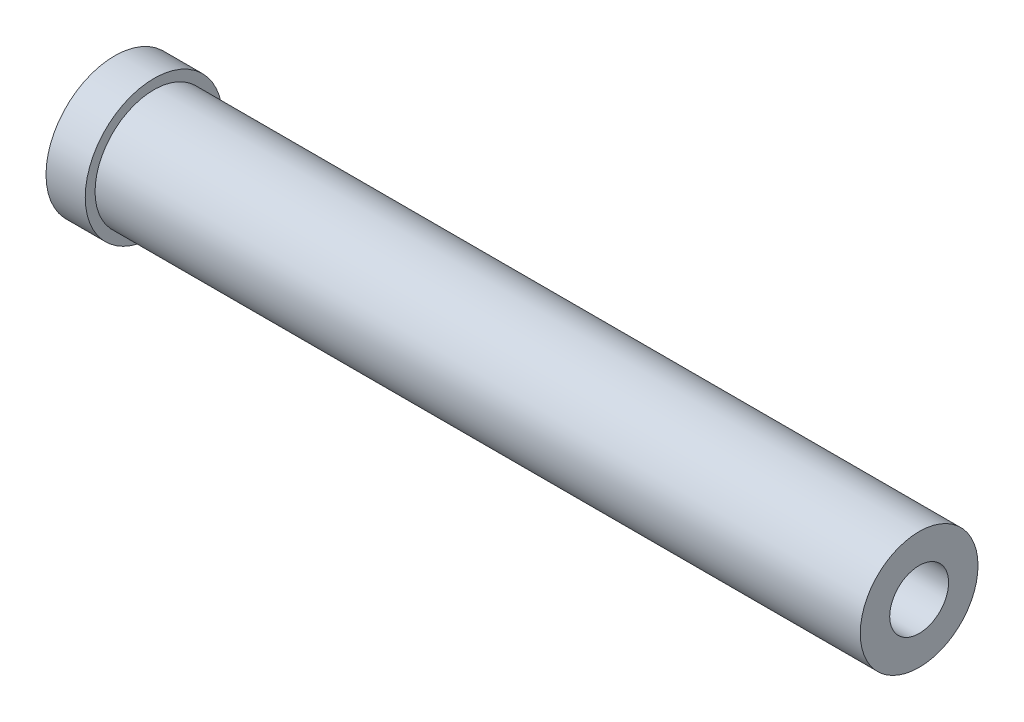
ISO-10303-21;
HEADER;
FILE_DESCRIPTION(('STEP AP214'),'2;1');
FILE_NAME('part.step','',(''),(''),'','','');
FILE_SCHEMA(('AUTOMOTIVE_DESIGN { 1 0 10303 214 1 1 1 1 }'));
ENDSEC;
DATA;
#1=APPLICATION_CONTEXT('core data for automotive mechanical design processes');
#2=APPLICATION_PROTOCOL_DEFINITION('international standard','automotive_design',2000,#1);
#3=PRODUCT_CONTEXT('',#1,'mechanical');
#4=PRODUCT('Part','Part','',(#3));
#5=PRODUCT_RELATED_PRODUCT_CATEGORY('part','',(#4));
#6=PRODUCT_DEFINITION_FORMATION('','',#4);
#7=PRODUCT_DEFINITION_CONTEXT('part definition',#1,'design');
#8=PRODUCT_DEFINITION('design','',#6,#7);
#9=PRODUCT_DEFINITION_SHAPE('','',#8);
#10=(LENGTH_UNIT() NAMED_UNIT(*) SI_UNIT(.MILLI.,.METRE.));
#11=(NAMED_UNIT(*) PLANE_ANGLE_UNIT() SI_UNIT($,.RADIAN.));
#12=(NAMED_UNIT(*) SI_UNIT($,.STERADIAN.) SOLID_ANGLE_UNIT());
#13=UNCERTAINTY_MEASURE_WITH_UNIT(LENGTH_MEASURE(1.E-05),#10,'distance_accuracy_value','');
#14=(GEOMETRIC_REPRESENTATION_CONTEXT(3) GLOBAL_UNCERTAINTY_ASSIGNED_CONTEXT((#13)) GLOBAL_UNIT_ASSIGNED_CONTEXT((#10,
#11,#12)) REPRESENTATION_CONTEXT('',''));
#15=CARTESIAN_POINT('',(0.,0.,0.));
#16=DIRECTION('',(0.,0.,1.));
#17=DIRECTION('',(1.,0.,0.));
#18=AXIS2_PLACEMENT_3D('',#15,#16,#17);
#19=CARTESIAN_POINT('',(-26.67,0.,0.));
#20=DIRECTION('',(1.,0.,0.));
#21=DIRECTION('',(0.,0.,-1.));
#22=AXIS2_PLACEMENT_3D('',#19,#20,#21);
#23=CYLINDRICAL_SURFACE('',#22,4.445);
#24=CARTESIAN_POINT('',(-26.67,0.,0.));
#25=DIRECTION('',(-1.,0.,0.));
#26=DIRECTION('',(0.,0.,1.));
#27=AXIS2_PLACEMENT_3D('',#24,#25,#26);
#28=CIRCLE('',#27,4.445);
#29=CARTESIAN_POINT('',(-26.67,0.,4.445));
#30=VERTEX_POINT('',#29);
#31=EDGE_CURVE('E69',#30,#30,#28,.T.);
#32=ORIENTED_EDGE('',*,*,#31,.F.);
#33=EDGE_LOOP('',(#32));
#34=FACE_BOUND('',#33,.T.);
#35=CARTESIAN_POINT('',(-24.13,0.,0.));
#36=DIRECTION('',(-1.,0.,0.));
#37=DIRECTION('',(0.,0.,1.));
#38=AXIS2_PLACEMENT_3D('',#35,#36,#37);
#39=CIRCLE('',#38,4.445);
#40=CARTESIAN_POINT('',(-24.13,0.,4.445));
#41=VERTEX_POINT('',#40);
#42=EDGE_CURVE('E61',#41,#41,#39,.T.);
#43=ORIENTED_EDGE('',*,*,#42,.T.);
#44=EDGE_LOOP('',(#43));
#45=FACE_BOUND('',#44,.T.);
#46=ADVANCED_FACE('F43',(#34,#45),#23,.T.);
#47=CARTESIAN_POINT('',(-26.67,0.,0.));
#48=DIRECTION('',(-1.,0.,0.));
#49=DIRECTION('',(0.,0.,1.));
#50=AXIS2_PLACEMENT_3D('',#47,#48,#49);
#51=PLANE('',#50);
#52=ORIENTED_EDGE('',*,*,#31,.T.);
#53=EDGE_LOOP('',(#52));
#54=FACE_BOUND('',#53,.T.);
#55=ADVANCED_FACE('F83',(#54),#51,.T.);
#56=CARTESIAN_POINT('',(-24.13,0.,0.));
#57=DIRECTION('',(-1.,0.,0.));
#58=DIRECTION('',(0.,0.,1.));
#59=AXIS2_PLACEMENT_3D('',#56,#57,#58);
#60=PLANE('',#59);
#61=CARTESIAN_POINT('',(-24.13,0.,0.));
#62=DIRECTION('',(-1.,0.,0.));
#63=DIRECTION('',(0.,0.,1.));
#64=AXIS2_PLACEMENT_3D('',#61,#62,#63);
#65=CIRCLE('',#64,3.81);
#66=CARTESIAN_POINT('',(-24.13,0.,3.81));
#67=VERTEX_POINT('',#66);
#68=EDGE_CURVE('E10',#67,#67,#65,.T.);
#69=ORIENTED_EDGE('',*,*,#68,.T.);
#70=EDGE_LOOP('',(#69));
#71=FACE_BOUND('',#70,.T.);
#72=ORIENTED_EDGE('',*,*,#42,.F.);
#73=EDGE_LOOP('',(#72));
#74=FACE_BOUND('',#73,.T.);
#75=ADVANCED_FACE('F81',(#71,#74),#60,.F.);
#76=CARTESIAN_POINT('',(25.4,0.,0.));
#77=DIRECTION('',(-1.,0.,0.));
#78=DIRECTION('',(0.,0.,1.));
#79=AXIS2_PLACEMENT_3D('',#76,#77,#78);
#80=CYLINDRICAL_SURFACE('',#79,3.81);
#81=CARTESIAN_POINT('',(25.4,0.,0.));
#82=DIRECTION('',(1.,0.,0.));
#83=DIRECTION('',(0.,0.,-1.));
#84=AXIS2_PLACEMENT_3D('',#81,#82,#83);
#85=CIRCLE('',#84,3.81);
#86=CARTESIAN_POINT('',(25.4,0.,-3.81));
#87=VERTEX_POINT('',#86);
#88=EDGE_CURVE('E52',#87,#87,#85,.T.);
#89=ORIENTED_EDGE('',*,*,#88,.F.);
#90=EDGE_LOOP('',(#89));
#91=FACE_BOUND('',#90,.T.);
#92=ORIENTED_EDGE('',*,*,#68,.F.);
#93=EDGE_LOOP('',(#92));
#94=FACE_BOUND('',#93,.T.);
#95=ADVANCED_FACE('F45',(#91,#94),#80,.T.);
#96=CARTESIAN_POINT('',(25.4,0.,0.));
#97=DIRECTION('',(-1.,0.,0.));
#98=DIRECTION('',(0.,0.,1.));
#99=AXIS2_PLACEMENT_3D('',#96,#97,#98);
#100=CYLINDRICAL_SURFACE('',#99,1.905);
#101=CARTESIAN_POINT('',(25.4,0.,0.));
#102=DIRECTION('',(1.,0.,0.));
#103=DIRECTION('',(0.,0.,-1.));
#104=AXIS2_PLACEMENT_3D('',#101,#102,#103);
#105=CIRCLE('',#104,1.905);
#106=CARTESIAN_POINT('',(25.4,0.,-1.905));
#107=VERTEX_POINT('',#106);
#108=EDGE_CURVE('E58',#107,#107,#105,.T.);
#109=ORIENTED_EDGE('',*,*,#108,.T.);
#110=EDGE_LOOP('',(#109));
#111=FACE_BOUND('',#110,.T.);
#112=CARTESIAN_POINT('',(-24.13,0.,0.));
#113=DIRECTION('',(-1.,0.,0.));
#114=DIRECTION('',(0.,0.,1.));
#115=AXIS2_PLACEMENT_3D('',#112,#113,#114);
#116=CIRCLE('',#115,1.905);
#117=CARTESIAN_POINT('',(-24.13,0.,1.905));
#118=VERTEX_POINT('',#117);
#119=EDGE_CURVE('E47',#118,#118,#116,.T.);
#120=ORIENTED_EDGE('',*,*,#119,.T.);
#121=EDGE_LOOP('',(#120));
#122=FACE_BOUND('',#121,.T.);
#123=ADVANCED_FACE('F90',(#111,#122),#100,.F.);
#124=CARTESIAN_POINT('',(25.4,0.,0.));
#125=DIRECTION('',(1.,0.,0.));
#126=DIRECTION('',(0.,0.,-1.));
#127=AXIS2_PLACEMENT_3D('',#124,#125,#126);
#128=PLANE('',#127);
#129=ORIENTED_EDGE('',*,*,#88,.T.);
#130=EDGE_LOOP('',(#129));
#131=FACE_BOUND('',#130,.T.);
#132=ORIENTED_EDGE('',*,*,#108,.F.);
#133=EDGE_LOOP('',(#132));
#134=FACE_BOUND('',#133,.T.);
#135=ADVANCED_FACE('F95',(#131,#134),#128,.T.);
#136=ORIENTED_EDGE('',*,*,#119,.F.);
#137=EDGE_LOOP('',(#136));
#138=FACE_BOUND('',#137,.T.);
#139=ADVANCED_FACE('F85',(#138),#60,.F.);
#140=CLOSED_SHELL('',(#46,#55,#75,#95,#123,#135,#139));
#141=MANIFOLD_SOLID_BREP('B2',#140);
#142=ADVANCED_BREP_SHAPE_REPRESENTATION('',(#18,#141),#14);
#143=SHAPE_DEFINITION_REPRESENTATION(#9,#142);
ENDSEC;
END-ISO-10303-21;
